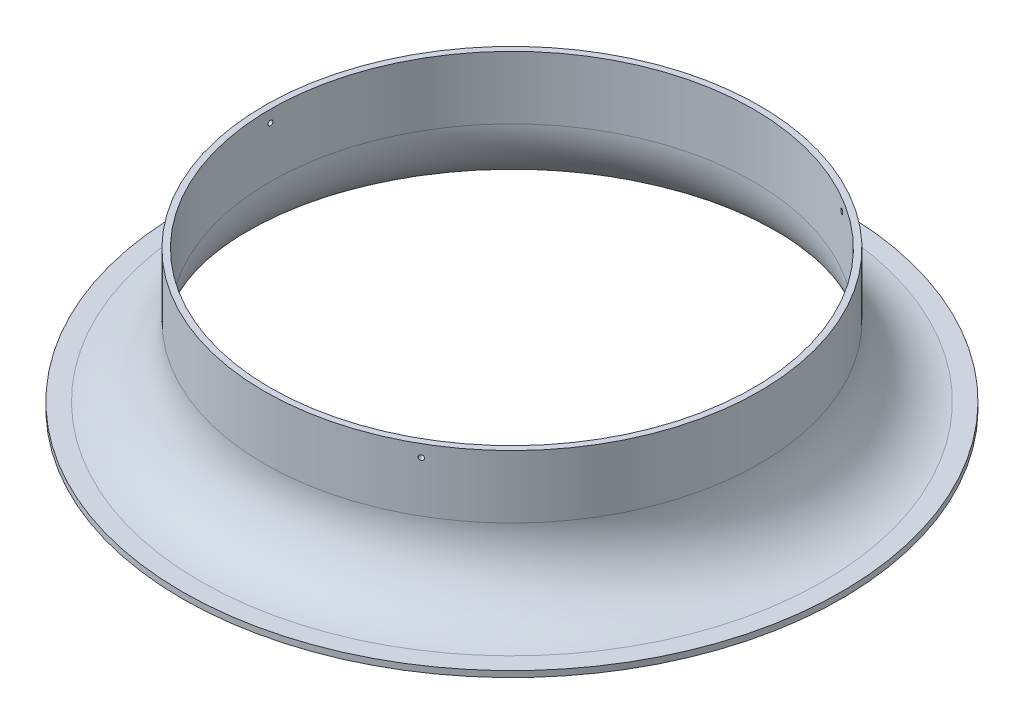
ISO-10303-21;
HEADER;
FILE_DESCRIPTION(('STEP AP214'),'2;1');
FILE_NAME('part.step','',(''),(''),'','','');
FILE_SCHEMA(('AUTOMOTIVE_DESIGN { 1 0 10303 214 1 1 1 1 }'));
ENDSEC;
DATA;
#1=APPLICATION_CONTEXT('core data for automotive mechanical design processes');
#2=APPLICATION_PROTOCOL_DEFINITION('international standard','automotive_design',2000,#1);
#3=PRODUCT_CONTEXT('',#1,'mechanical');
#4=PRODUCT('Part','Part','',(#3));
#5=PRODUCT_RELATED_PRODUCT_CATEGORY('part','',(#4));
#6=PRODUCT_DEFINITION_FORMATION('','',#4);
#7=PRODUCT_DEFINITION_CONTEXT('part definition',#1,'design');
#8=PRODUCT_DEFINITION('design','',#6,#7);
#9=PRODUCT_DEFINITION_SHAPE('','',#8);
#10=(LENGTH_UNIT() NAMED_UNIT(*) SI_UNIT(.MILLI.,.METRE.));
#11=(NAMED_UNIT(*) PLANE_ANGLE_UNIT() SI_UNIT($,.RADIAN.));
#12=(NAMED_UNIT(*) SI_UNIT($,.STERADIAN.) SOLID_ANGLE_UNIT());
#13=UNCERTAINTY_MEASURE_WITH_UNIT(LENGTH_MEASURE(1.E-05),#10,'distance_accuracy_value','');
#14=(GEOMETRIC_REPRESENTATION_CONTEXT(3) GLOBAL_UNCERTAINTY_ASSIGNED_CONTEXT((#13)) GLOBAL_UNIT_ASSIGNED_CONTEXT((#10,
#11,#12)) REPRESENTATION_CONTEXT('',''));
#15=CARTESIAN_POINT('',(0.,0.,0.));
#16=DIRECTION('',(0.,0.,1.));
#17=DIRECTION('',(1.,0.,0.));
#18=AXIS2_PLACEMENT_3D('',#15,#16,#17);
#19=CARTESIAN_POINT('',(0.,91.,0.));
#20=DIRECTION('',(0.,1.,0.));
#21=DIRECTION('',(0.,0.,1.));
#22=AXIS2_PLACEMENT_3D('',#19,#20,#21);
#23=PLANE('',#22);
#24=CARTESIAN_POINT('',(0.,91.,0.));
#25=DIRECTION('',(0.,1.,0.));
#26=DIRECTION('',(0.,0.,1.));
#27=AXIS2_PLACEMENT_3D('',#24,#25,#26);
#28=CIRCLE('',#27,200.);
#29=CARTESIAN_POINT('',(0.,91.,200.));
#30=VERTEX_POINT('',#29);
#31=EDGE_CURVE('E206',#30,#30,#28,.T.);
#32=ORIENTED_EDGE('',*,*,#31,.F.);
#33=EDGE_LOOP('',(#32));
#34=FACE_BOUND('',#33,.T.);
#35=CARTESIAN_POINT('',(0.,91.,0.));
#36=DIRECTION('',(0.,1.,0.));
#37=DIRECTION('',(0.,0.,1.));
#38=AXIS2_PLACEMENT_3D('',#35,#36,#37);
#39=CIRCLE('',#38,205.);
#40=CARTESIAN_POINT('',(0.,91.,205.));
#41=VERTEX_POINT('',#40);
#42=EDGE_CURVE('E12',#41,#41,#39,.T.);
#43=ORIENTED_EDGE('',*,*,#42,.T.);
#44=EDGE_LOOP('',(#43));
#45=FACE_BOUND('',#44,.T.);
#46=ADVANCED_FACE('F39',(#34,#45),#23,.T.);
#47=CARTESIAN_POINT('',(0.,91.,0.));
#48=DIRECTION('',(0.,-1.,0.));
#49=DIRECTION('',(0.,0.,-1.));
#50=AXIS2_PLACEMENT_3D('',#47,#48,#49);
#51=CYLINDRICAL_SURFACE('',#50,205.);
#52=CARTESIAN_POINT('',(104.227172642709,81.,176.526758546423));
#53=CARTESIAN_POINT('',(104.227168395237,81.1123380097675,176.52676115103));
#54=CARTESIAN_POINT('',(104.218994986844,81.2247574071282,176.53158769367));
#55=CARTESIAN_POINT('',(104.186499321467,81.446499916236,176.550768056649));
#56=CARTESIAN_POINT('',(104.16215764248,81.5558191390448,176.565133335309));
#57=CARTESIAN_POINT('',(104.09800716114,81.7681167307759,176.602962273534));
#58=CARTESIAN_POINT('',(104.058205765456,81.871098108798,176.626421576188));
#59=CARTESIAN_POINT('',(103.964258372193,82.067814272913,176.681736289023));
#60=CARTESIAN_POINT('',(103.910115934623,82.1615513458919,176.713589615467));
#61=CARTESIAN_POINT('',(103.788988831066,82.337163911466,176.784758159353));
#62=CARTESIAN_POINT('',(103.722002440412,82.419037808497,176.824074378894));
#63=CARTESIAN_POINT('',(103.577067024338,82.5685870737823,176.909011151793));
#64=CARTESIAN_POINT('',(103.499117567966,82.6362618836161,176.954631952981));
#65=CARTESIAN_POINT('',(103.334447955804,82.7554882076823,177.050842824916));
#66=CARTESIAN_POINT('',(103.24772778861,82.8070397009503,177.101432902125));
#67=CARTESIAN_POINT('',(103.067959593281,82.892555505312,177.206113080374));
#68=CARTESIAN_POINT('',(102.974911579206,82.9265198554847,177.260203173638));
#69=CARTESIAN_POINT('',(102.785118426737,82.9758963905388,177.370322940449));
#70=CARTESIAN_POINT('',(102.688373400715,82.9913091388397,177.426352555039));
#71=CARTESIAN_POINT('',(102.493923864772,83.0031466610049,177.538751207088));
#72=CARTESIAN_POINT('',(102.396219356803,82.9995714734797,177.595120243855));
#73=CARTESIAN_POINT('',(102.202629180777,82.9735351842157,177.706598267463));
#74=CARTESIAN_POINT('',(102.10674345156,82.9510747187027,177.761707296687));
#75=CARTESIAN_POINT('',(101.919518293179,82.8879064123545,177.869118867847));
#76=CARTESIAN_POINT('',(101.828178869366,82.8471985500421,177.921421406479));
#77=CARTESIAN_POINT('',(101.652653289692,82.7486902947598,178.021763587781));
#78=CARTESIAN_POINT('',(101.56846725538,82.6908896114225,178.069803158014));
#79=CARTESIAN_POINT('',(101.409660255999,82.5598367412882,178.160290674583));
#80=CARTESIAN_POINT('',(101.335039289779,82.4865845563479,178.202738621589));
#81=CARTESIAN_POINT('',(101.197500564345,82.3267044295223,178.280879936458));
#82=CARTESIAN_POINT('',(101.134583294486,82.2400759286218,178.316573021886));
#83=CARTESIAN_POINT('',(101.022264856979,82.0559042566187,178.380229242276));
#84=CARTESIAN_POINT('',(100.972863691134,81.958361084059,178.408192376206));
#85=CARTESIAN_POINT('',(100.889000288048,81.7551287321912,178.455630210016));
#86=CARTESIAN_POINT('',(100.85453806485,81.649439545225,178.475104901917));
#87=CARTESIAN_POINT('',(100.801546552347,81.4329155018058,178.505039555558));
#88=CARTESIAN_POINT('',(100.783017257814,81.3220806470411,178.515499520257));
#89=CARTESIAN_POINT('',(100.762426882401,81.0984164298752,178.527122510115));
#90=CARTESIAN_POINT('',(100.76036512244,80.9855871499116,178.528285918643));
#91=CARTESIAN_POINT('',(100.772767559509,80.7611326610921,178.521285473649));
#92=CARTESIAN_POINT('',(100.787231755182,80.6495074521373,178.513121620895));
#93=CARTESIAN_POINT('',(100.832268115803,80.4306319777467,178.487686882075));
#94=CARTESIAN_POINT('',(100.862839973978,80.3233816290332,178.470416169452));
#95=CARTESIAN_POINT('',(100.93920962242,80.1162978481232,178.427234115205));
#96=CARTESIAN_POINT('',(100.985007414156,80.0164644166429,178.401322772747));
#97=CARTESIAN_POINT('',(101.090511256764,79.8270448436075,178.341560483357));
#98=CARTESIAN_POINT('',(101.150217762685,79.7374590374656,178.307709276656));
#99=CARTESIAN_POINT('',(101.281820839128,79.5710811200289,178.232989308407));
#100=CARTESIAN_POINT('',(101.353717417349,79.4942890168132,178.192120542427));
#101=CARTESIAN_POINT('',(101.507639213445,79.3556758276746,178.104483407025));
#102=CARTESIAN_POINT('',(101.589664773982,79.2938552484431,178.057714838015));
#103=CARTESIAN_POINT('',(101.761492711948,79.1869435213972,177.959569502419));
#104=CARTESIAN_POINT('',(101.851295080179,79.141852353796,177.908192741284));
#105=CARTESIAN_POINT('',(102.036108606868,79.0696802639663,177.802260602099));
#106=CARTESIAN_POINT('',(102.131119668855,79.0425990082937,177.747705282919));
#107=CARTESIAN_POINT('',(102.323644131753,79.0072143708042,177.63694486286));
#108=CARTESIAN_POINT('',(102.421157536465,78.9989110175094,177.580739759475));
#109=CARTESIAN_POINT('',(102.615910454843,79.0013180088449,177.468271997391));
#110=CARTESIAN_POINT('',(102.713149980207,79.0120275286905,177.412009341295));
#111=CARTESIAN_POINT('',(102.904603663946,79.0521546190525,177.301028742073));
#112=CARTESIAN_POINT('',(102.998817816244,79.0815722271406,177.246310802051));
#113=CARTESIAN_POINT('',(103.18155971839,79.1582809187302,177.139992431689));
#114=CARTESIAN_POINT('',(103.270087362804,79.2055723335183,177.088392059154));
#115=CARTESIAN_POINT('',(103.438956139936,79.3166841136363,176.989807402757));
#116=CARTESIAN_POINT('',(103.51929759124,79.3805038353835,176.942822939257));
#117=CARTESIAN_POINT('',(103.669534847217,79.5228561233377,176.854841994794));
#118=CARTESIAN_POINT('',(103.739431310705,79.6013877608893,176.813845136166));
#119=CARTESIAN_POINT('',(103.866840915467,79.7709630747789,176.739030304498));
#120=CARTESIAN_POINT('',(103.924350975797,79.8620098548782,176.705214117578));
#121=CARTESIAN_POINT('',(104.025378969211,80.0540488802093,176.645758451921));
#122=CARTESIAN_POINT('',(104.068889955773,80.1550460305758,176.620123032637));
#123=CARTESIAN_POINT('',(104.140624529203,80.3640063232374,176.577835735522));
#124=CARTESIAN_POINT('',(104.168866432679,80.4719609445803,176.56117309415));
#125=CARTESIAN_POINT('',(104.201751968908,80.6505024418834,176.541765840283));
#126=CARTESIAN_POINT('',(104.211272978661,80.7199293229409,176.536145419518));
#127=CARTESIAN_POINT('',(104.223984643264,80.8595601979257,176.528640958421));
#128=CARTESIAN_POINT('',(104.227175298307,80.9297641918293,176.526756917974));
#129=CARTESIAN_POINT('',(104.227172642709,81.,176.526758546423));
#130=B_SPLINE_CURVE_WITH_KNOTS('',3,(#52,#53,#54,#55,#56,#57,#58,#59,#60,#61,#62,#63,#64,#65,
#66,#67,#68,#69,#70,#71,#72,#73,#74,#75,#76,#77,#78,#79,#80,#81,#82,#83,#84,#85,#86,#87,#88,#89,
#90,#91,#92,#93,#94,#95,#96,#97,#98,#99,#100,#101,#102,#103,#104,#105,#106,#107,#108,#109,#110,
#111,#112,#113,#114,#115,#116,#117,#118,#119,#120,#121,#122,#123,#124,#125,#126,#127,#128,#129),
.UNSPECIFIED.,.T.,.F.,(4,2,2,2,2,2,2,2,2,2,2,2,2,2,2,2,2,2,2,2,2,2,2,2,2,2,2,2,2,2,2,2,2,2,2,2,
2,2,4),(0.,0.336757667809877,0.673920596383109,1.01092219081739,1.34784020647964,
1.68480349470548,2.02178003251327,2.35875700847501,2.6957332356654,3.03269922849439,
3.36966453612855,3.70661849220028,4.04357284486868,4.38053292193796,4.71749295851461,
5.05446708093893,5.39144124835089,5.72841573255819,6.06539010619509,6.40235058372321,
6.73931103358174,7.07626506623916,7.41321913143483,7.75018422225991,8.08714952587419,
8.4241262320402,8.76110253964459,9.09807260813512,9.43504318845568,9.77199915124033,
10.1089557907411,10.4459186759569,10.7828684424111,11.1197969468573,11.4568091609947,
11.7939883479458,12.1307621562335,12.3413093052063,12.5518564477563),.UNSPECIFIED.);
#131=CARTESIAN_POINT('',(102.500000000001,83.,177.53520777581));
#132=VERTEX_POINT('',#131);
#133=CARTESIAN_POINT('',(102.500000000001,79.,177.53520777581));
#134=VERTEX_POINT('',#133);
#135=EDGE_CURVE('E44',#132,#134,#130,.T.);
#136=ORIENTED_EDGE('',*,*,#135,.F.);
#137=EDGE_CURVE('E327',#134,#132,#130,.T.);
#138=ORIENTED_EDGE('',*,*,#137,.F.);
#139=EDGE_LOOP('',(#136,#138));
#140=FACE_BOUND('',#139,.T.);
#141=CARTESIAN_POINT('',(100.763071027569,81.,-178.526758546424));
#142=CARTESIAN_POINT('',(100.763075406961,81.1123380097675,-178.526756170309));
#143=CARTESIAN_POINT('',(100.771342019696,81.2247574071282,-178.522091062326));
#144=CARTESIAN_POINT('',(100.804200533977,81.446499916236,-178.503539172086));
#145=CARTESIAN_POINT('',(100.828812069724,81.5558191390448,-178.489641299042));
#146=CARTESIAN_POINT('',(100.893648131894,81.7681167307759,-178.452999821649));
#147=CARTESIAN_POINT('',(100.93386518179,81.871098108798,-178.430260453208));
#148=CARTESIAN_POINT('',(101.02874282494,82.067814272913,-178.37655698044));
#149=CARTESIAN_POINT('',(101.08339983362,82.1615513458918,-178.345594917304));
#150=CARTESIAN_POINT('',(101.205597152354,82.337163911466,-178.276280040479));
#151=CARTESIAN_POINT('',(101.273139192584,82.419037808497,-178.237926234235));
#152=CARTESIAN_POINT('',(101.419164303667,82.5685870737823,-178.154876868458));
#153=CARTESIAN_POINT('',(101.497647804623,82.6362618836161,-178.110181059622));
#154=CARTESIAN_POINT('',(101.663303669921,82.7554882076823,-178.015678428226));
#155=CARTESIAN_POINT('',(101.750476045559,82.8070397009502,-177.96587159902));
#156=CARTESIAN_POINT('',(101.931015836861,82.892555505312,-177.862527864197));
#157=CARTESIAN_POINT('',(102.024383238758,82.9265198554847,-177.808990966868));
#158=CARTESIAN_POINT('',(102.214646330509,82.9758963905388,-177.699685158771));
#159=CARTESIAN_POINT('',(102.31154191312,82.9913091388397,-177.643916315841));
#160=CARTESIAN_POINT('',(102.506106769116,83.0031466610049,-177.531717403985));
#161=CARTESIAN_POINT('',(102.603776040929,82.9995714734797,-177.475287336403));
#162=CARTESIAN_POINT('',(102.797113929349,82.9735351842157,-177.363372337846));
#163=CARTESIAN_POINT('',(102.892782613244,82.9510747187027,-177.307887375095));
#164=CARTESIAN_POINT('',(103.079416341719,82.8879064123545,-177.199451417289));
#165=CARTESIAN_POINT('',(103.170381380763,82.8471985500421,-177.146500425217));
#166=CARTESIAN_POINT('',(103.345043048679,82.7486902947598,-177.044661904856));
#167=CARTESIAN_POINT('',(103.428739554044,82.6908896114225,-176.995774445615));
#168=CARTESIAN_POINT('',(103.586507541808,82.5598367412882,-176.903487308136));
#169=CARTESIAN_POINT('',(103.660579025364,82.4865845563479,-176.860087629238));
#170=CARTESIAN_POINT('',(103.797020751843,82.3267044295223,-176.780046256442));
#171=CARTESIAN_POINT('',(103.859390505492,82.2400759286218,-176.743404845122));
#172=CARTESIAN_POINT('',(103.970677628213,82.0559042566187,-176.677962335122));
#173=CARTESIAN_POINT('',(104.019594995487,81.958361084059,-176.649161237489));
#174=CARTESIAN_POINT('',(104.102609066211,81.7551287321912,-176.600252316873));
#175=CARTESIAN_POINT('',(104.136705755727,81.649439545225,-176.580144502064));
#176=CARTESIAN_POINT('',(104.189125682485,81.4329155018058,-176.549219832872));
#177=CARTESIAN_POINT('',(104.207448924904,81.3220806470411,-176.538402975441));
#178=CARTESIAN_POINT('',(104.227809917095,81.0984164298752,-176.52638268219));
#179=CARTESIAN_POINT('',(104.229848338416,80.9855871499116,-176.52517884995));
#180=CARTESIAN_POINT('',(104.217584556679,80.7611326610921,-176.532419453024));
#181=CARTESIAN_POINT('',(104.203282354964,80.6495074521373,-176.540863887545));
#182=CARTESIAN_POINT('',(104.158737044698,80.4306319777467,-176.567149150527));
#183=CARTESIAN_POINT('',(104.128494239736,80.3233816290332,-176.584989800036));
#184=CARTESIAN_POINT('',(104.05291265955,80.1162978481233,-176.629536828541));
#185=CARTESIAN_POINT('',(104.007573882868,80.0164644166429,-176.656243208393));
#186=CARTESIAN_POINT('',(103.903066300763,79.8270448436075,-176.717731071593));
#187=CARTESIAN_POINT('',(103.843897042851,79.7374590374656,-176.752512819141));
#188=CARTESIAN_POINT('',(103.713386113956,79.5710811200289,-176.829124442433));
#189=CARTESIAN_POINT('',(103.642044435285,79.4942890168132,-176.870954322627));
#190=CARTESIAN_POINT('',(103.489187551665,79.3556758276746,-176.960435940542));
#191=CARTESIAN_POINT('',(103.407672002534,79.2938552484431,-177.008087875221));
#192=CARTESIAN_POINT('',(103.236761679662,79.1869435213972,-177.107822566782));
#193=CARTESIAN_POINT('',(103.14736691524,79.141852353796,-177.159905318422));
#194=CARTESIAN_POINT('',(102.963220228284,79.0696802639663,-177.266992457906));
#195=CARTESIAN_POINT('',(102.868468404969,79.0425990082937,-177.321996791637));
#196=CARTESIAN_POINT('',(102.676284836015,79.0072143708042,-177.433347657327));
#197=CARTESIAN_POINT('',(102.578853086305,78.9989110175094,-177.489694191325));
#198=CARTESIAN_POINT('',(102.384076688045,79.0013180088449,-177.60212128506));
#199=CARTESIAN_POINT('',(102.286732035899,79.0120275286905,-177.658201856228));
#200=CARTESIAN_POINT('',(102.094893175777,79.0521546190525,-177.768515310383));
#201=CARTESIAN_POINT('',(102.000398973525,79.0815722271406,-177.822748189659));
#202=CARTESIAN_POINT('',(101.81695361283,79.1582809187302,-177.927848134072));
#203=CARTESIAN_POINT('',(101.728002557163,79.2055723335183,-177.978715136804));
#204=CARTESIAN_POINT('',(101.558191351734,79.3166841136363,-178.075667459507));
#205=CARTESIAN_POINT('',(101.477330887108,79.3805038353835,-178.121752965564));
#206=CARTESIAN_POINT('',(101.326018526165,79.5228561233377,-178.207871773604));
#207=CARTESIAN_POINT('',(101.255565973374,79.6013877608893,-178.247905457305));
#208=CARTESIAN_POINT('',(101.127069626189,79.7709630747789,-178.320837995881));
#209=CARTESIAN_POINT('',(101.069028919092,79.8620098548782,-178.35373507564));
#210=CARTESIAN_POINT('',(100.967024805527,80.0540488802093,-178.411500051601));
#211=CARTESIAN_POINT('',(100.923068387909,80.1550460305758,-178.436363961666));
#212=CARTESIAN_POINT('',(100.850579227636,80.3640063232374,-178.477344276028));
#213=CARTESIAN_POINT('',(100.822028005175,80.4719609445803,-178.493471161204));
#214=CARTESIAN_POINT('',(100.788778062194,80.6505024418833,-178.512247244062));
#215=CARTESIAN_POINT('',(100.779150130155,80.7199293229409,-178.517682469995));
#216=CARTESIAN_POINT('',(100.766295243901,80.8595601979257,-178.524938863917));
#217=CARTESIAN_POINT('',(100.763068289491,80.9297641918293,-178.526760032015));
#218=CARTESIAN_POINT('',(100.763071027569,81.,-178.526758546424));
#219=B_SPLINE_CURVE_WITH_KNOTS('',3,(#141,#142,#143,#144,#145,#146,#147,#148,#149,#150,#151,
#152,#153,#154,#155,#156,#157,#158,#159,#160,#161,#162,#163,#164,#165,#166,#167,#168,#169,#170,
#171,#172,#173,#174,#175,#176,#177,#178,#179,#180,#181,#182,#183,#184,#185,#186,#187,#188,#189,
#190,#191,#192,#193,#194,#195,#196,#197,#198,#199,#200,#201,#202,#203,#204,#205,#206,#207,#208,
#209,#210,#211,#212,#213,#214,#215,#216,#217,#218),.UNSPECIFIED.,.T.,.F.,(4,2,2,2,2,2,2,2,2,2,2,
2,2,2,2,2,2,2,2,2,2,2,2,2,2,2,2,2,2,2,2,2,2,2,2,2,2,2,4),(0.,0.336757667809877,
0.673920596383108,1.01092219081739,1.34784020647961,1.68480349470546,2.02178003251327,
2.35875700847499,2.69573323566539,3.03269922849439,3.36966453612856,3.70661849220029,
4.04357284486868,4.38053292193795,4.71749295851463,5.05446708093894,5.3914412483509,
5.72841573255819,6.06539010619509,6.40235058372322,6.73931103358174,7.07626506623916,
7.41321913143483,7.75018422225989,8.08714952587418,8.42412623204019,8.76110253964458,
9.09807260813511,9.43504318845565,9.77199915124033,10.1089557907411,10.4459186759569,
10.7828684424111,11.1197969468573,11.4568091609947,11.7939883479458,12.1307621562335,
12.3413093052062,12.5518564477563),.UNSPECIFIED.);
#220=CARTESIAN_POINT('',(102.499999999998,83.,-177.535207775811));
#221=VERTEX_POINT('',#220);
#222=CARTESIAN_POINT('',(102.499999999998,79.,-177.535207775811));
#223=VERTEX_POINT('',#222);
#224=EDGE_CURVE('E64',#221,#223,#219,.T.);
#225=ORIENTED_EDGE('',*,*,#224,.F.);
#226=EDGE_CURVE('E76',#223,#221,#219,.T.);
#227=ORIENTED_EDGE('',*,*,#226,.F.);
#228=EDGE_LOOP('',(#225,#227));
#229=FACE_BOUND('',#228,.T.);
#230=CARTESIAN_POINT('',(-204.990243670278,81.,2.));
#231=CARTESIAN_POINT('',(-204.990243802198,81.1123380097675,1.99999501927744));
#232=CARTESIAN_POINT('',(-204.990337006541,81.2247574071282,1.99050336865397));
#233=CARTESIAN_POINT('',(-204.990699855446,81.446499916236,1.95277111543561));
#234=CARTESIAN_POINT('',(-204.990969712204,81.5558191390448,1.92450796373124));
#235=CARTESIAN_POINT('',(-204.991655293035,81.7681167307759,1.85003754811353));
#236=CARTESIAN_POINT('',(-204.992070947247,81.871098108798,1.80383887701849));
#237=CARTESIAN_POINT('',(-204.993001197134,82.067814272913,1.69482069141531));
#238=CARTESIAN_POINT('',(-204.993515768244,82.1615513458919,1.63200530183511));
#239=CARTESIAN_POINT('',(-204.994585983421,82.337163911466,1.49152188112479));
#240=CARTESIAN_POINT('',(-204.995141632997,82.419037808497,1.4138518553402));
#241=CARTESIAN_POINT('',(-204.996231328007,82.5685870737823,1.24586571666291));
#242=CARTESIAN_POINT('',(-204.99676537259,82.6362618836161,1.15554910663919));
#243=CARTESIAN_POINT('',(-204.997751625725,82.7554882076823,0.964835603307878));
#244=CARTESIAN_POINT('',(-204.99820383417,82.8070397009503,0.864438696893554));
#245=CARTESIAN_POINT('',(-204.998975430142,82.892555505312,0.656414783821005));
#246=CARTESIAN_POINT('',(-204.999294817964,82.9265198554847,0.548787793228743));
#247=CARTESIAN_POINT('',(-204.999764757247,82.9758963905388,0.329362218320729));
#248=CARTESIAN_POINT('',(-204.999915313835,82.9913091388397,0.217563760800424));
#249=CARTESIAN_POINT('',(-205.000030633889,83.0031466610049,-0.00703380310431611));
#250=CARTESIAN_POINT('',(-204.999995397732,82.9995714734797,-0.119832907453546));
#251=CARTESIAN_POINT('',(-204.999743110127,82.9735351842157,-0.343225929618458));
#252=CARTESIAN_POINT('',(-204.999526064805,82.9510747187027,-0.453819921593636));
#253=CARTESIAN_POINT('',(-204.998934634899,82.8879064123546,-0.669667450558952));
#254=CARTESIAN_POINT('',(-204.99856025013,82.8471985500421,-0.774920981263191));
#255=CARTESIAN_POINT('',(-204.997696338371,82.7486902947598,-0.977101682926152));
#256=CARTESIAN_POINT('',(-204.997206809425,82.6908896114225,-1.07402871240085));
#257=CARTESIAN_POINT('',(-204.996167797808,82.5598367412882,-1.25680336644838));
#258=CARTESIAN_POINT('',(-204.995618315144,82.4865845563479,-1.34265099235263));
#259=CARTESIAN_POINT('',(-204.994521316188,82.3267044295223,-1.50083368001736));
#260=CARTESIAN_POINT('',(-204.993973799979,82.2400759286218,-1.57316817676583));
#261=CARTESIAN_POINT('',(-204.992942485192,82.0559042566187,-1.70226690715558));
#262=CARTESIAN_POINT('',(-204.992458686622,81.958361084059,-1.75903113871815));
#263=CARTESIAN_POINT('',(-204.99160935426,81.7551287321912,-1.85537789314405));
#264=CARTESIAN_POINT('',(-204.991243820578,81.649439545225,-1.8949603998545));
#265=CARTESIAN_POINT('',(-204.990672234833,81.4329155018058,-1.95581972268782));
#266=CARTESIAN_POINT('',(-204.990466182718,81.3220806470412,-1.97709654481727));
#267=CARTESIAN_POINT('',(-204.990236799497,81.0984164298752,-2.00073982792685));
#268=CARTESIAN_POINT('',(-204.990213460856,80.9855871499116,-2.003107068694));
#269=CARTESIAN_POINT('',(-204.990352116189,80.7611326610921,-1.98886602062687));
#270=CARTESIAN_POINT('',(-204.990514110147,80.6495074521373,-1.97225773335078));
#271=CARTESIAN_POINT('',(-204.991005160501,80.4306319777467,-1.92053773154975));
#272=CARTESIAN_POINT('',(-204.991334213716,80.3233816290332,-1.88542636941704));
#273=CARTESIAN_POINT('',(-204.992122281971,80.1162978481232,-1.79769728666529));
#274=CARTESIAN_POINT('',(-204.992581297024,80.0164644166429,-1.74507956435572));
#275=CARTESIAN_POINT('',(-204.993577557528,79.8270448436075,-1.62382941176518));
#276=CARTESIAN_POINT('',(-204.994114805537,79.7374590374656,-1.55519645751589));
#277=CARTESIAN_POINT('',(-204.995206953085,79.5710811200289,-1.40386486597505));
#278=CARTESIAN_POINT('',(-204.995761852635,79.4942890168132,-1.32116621980121));
#279=CARTESIAN_POINT('',(-204.996826765111,79.3556758276746,-1.14404746648463));
#280=CARTESIAN_POINT('',(-204.997336776517,79.2938552484431,-1.04962696279465));
#281=CARTESIAN_POINT('',(-204.998254391611,79.1869435213972,-0.851746935638301));
#282=CARTESIAN_POINT('',(-204.99866199542,79.141852353796,-0.748287422863031));
#283=CARTESIAN_POINT('',(-204.999328835153,79.0696802639663,-0.535268144194743));
#284=CARTESIAN_POINT('',(-204.999588073825,79.0425990082937,-0.425708491283334));
#285=CARTESIAN_POINT('',(-204.999928967769,79.0072143708042,-0.20359720553386));
#286=CARTESIAN_POINT('',(-205.000010622771,78.9989110175094,-0.091045568151476));
#287=CARTESIAN_POINT('',(-204.999987142889,79.0013180088449,0.133849287666731));
#288=CARTESIAN_POINT('',(-204.999882016107,79.0120275286905,0.24619251493182));
#289=CARTESIAN_POINT('',(-204.999496839723,79.0521546190525,0.467486568308419));
#290=CARTESIAN_POINT('',(-204.99921678977,79.0815722271406,0.576437387606442));
#291=CARTESIAN_POINT('',(-204.998513331221,79.1582809187302,0.787855702381493));
#292=CARTESIAN_POINT('',(-204.998089919968,79.2055723335183,0.890323077648376));
#293=CARTESIAN_POINT('',(-204.99714749167,79.3166841136363,1.08586005674925));
#294=CARTESIAN_POINT('',(-204.996628478349,79.3805038353835,1.17893002630538));
#295=CARTESIAN_POINT('',(-204.995553373383,79.5228561233377,1.35302977880849));
#296=CARTESIAN_POINT('',(-204.99499728408,79.6013877608893,1.43406032113771));
#297=CARTESIAN_POINT('',(-204.993910541657,79.7709630747789,1.58180769138151));
#298=CARTESIAN_POINT('',(-204.99337989489,79.8620098548782,1.64852095806027));
#299=CARTESIAN_POINT('',(-204.992403774738,80.0540488802093,1.7657415996785));
#300=CARTESIAN_POINT('',(-204.991958343683,80.1550460305758,1.81624092902735));
#301=CARTESIAN_POINT('',(-204.991203756839,80.3640063232374,1.89950854050427));
#302=CARTESIAN_POINT('',(-204.990894437855,80.4719609445803,1.93229806705228));
#303=CARTESIAN_POINT('',(-204.990530031103,80.6505024418833,1.97048140377726));
#304=CARTESIAN_POINT('',(-204.990423108818,80.7199293229409,1.98153705047546));
#305=CARTESIAN_POINT('',(-204.990279887167,80.8595601979257,1.9962979054948));
#306=CARTESIAN_POINT('',(-204.990243587799,80.9297641918293,2.00000311404016));
#307=CARTESIAN_POINT('',(-204.990243670278,81.,2.));
#308=B_SPLINE_CURVE_WITH_KNOTS('',3,(#230,#231,#232,#233,#234,#235,#236,#237,#238,#239,#240,
#241,#242,#243,#244,#245,#246,#247,#248,#249,#250,#251,#252,#253,#254,#255,#256,#257,#258,#259,
#260,#261,#262,#263,#264,#265,#266,#267,#268,#269,#270,#271,#272,#273,#274,#275,#276,#277,#278,
#279,#280,#281,#282,#283,#284,#285,#286,#287,#288,#289,#290,#291,#292,#293,#294,#295,#296,#297,
#298,#299,#300,#301,#302,#303,#304,#305,#306,#307),.UNSPECIFIED.,.T.,.F.,(4,2,2,2,2,2,2,2,2,2,2,
2,2,2,2,2,2,2,2,2,2,2,2,2,2,2,2,2,2,2,2,2,2,2,2,2,2,2,4),(0.,0.336757667809877,
0.673920596383107,1.01092219081739,1.34784020647963,1.68480349470546,2.02178003251327,
2.35875700847501,2.6957332356654,3.03269922849439,3.36966453612855,3.70661849220027,
4.04357284486868,4.38053292193795,4.71749295851461,5.05446708093894,5.39144124835089,
5.72841573255818,6.06539010619508,6.40235058372319,6.73931103358174,7.07626506623916,
7.41321913143484,7.75018422225991,8.08714952587419,8.42412623204021,8.7611025396446,
9.09807260813514,9.43504318845567,9.77199915124033,10.1089557907411,10.4459186759569,
10.7828684424111,11.1197969468573,11.4568091609948,11.7939883479458,12.1307621562335,
12.3413093052062,12.5518564477563),.UNSPECIFIED.);
#309=CARTESIAN_POINT('',(-205.,83.,0.));
#310=VERTEX_POINT('',#309);
#311=CARTESIAN_POINT('',(-205.,79.,0.));
#312=VERTEX_POINT('',#311);
#313=EDGE_CURVE('E182',#310,#312,#308,.T.);
#314=ORIENTED_EDGE('',*,*,#313,.F.);
#315=EDGE_CURVE('E146',#312,#310,#308,.T.);
#316=ORIENTED_EDGE('',*,*,#315,.F.);
#317=EDGE_LOOP('',(#314,#316));
#318=FACE_BOUND('',#317,.T.);
#319=CARTESIAN_POINT('',(0.,39.,0.));
#320=DIRECTION('',(0.,1.,0.));
#321=DIRECTION('',(0.,0.,1.));
#322=AXIS2_PLACEMENT_3D('',#319,#320,#321);
#323=CIRCLE('',#322,205.);
#324=CARTESIAN_POINT('',(0.,39.,205.));
#325=VERTEX_POINT('',#324);
#326=EDGE_CURVE('E223',#325,#325,#323,.T.);
#327=ORIENTED_EDGE('',*,*,#326,.T.);
#328=EDGE_LOOP('',(#327));
#329=FACE_BOUND('',#328,.T.);
#330=ORIENTED_EDGE('',*,*,#42,.F.);
#331=EDGE_LOOP('',(#330));
#332=FACE_BOUND('',#331,.T.);
#333=ADVANCED_FACE('F41',(#140,#229,#318,#329,#332),#51,.T.);
#334=CARTESIAN_POINT('',(0.,91.,0.));
#335=DIRECTION('',(0.,-1.,0.));
#336=DIRECTION('',(0.,0.,-1.));
#337=AXIS2_PLACEMENT_3D('',#334,#335,#336);
#338=CYLINDRICAL_SURFACE('',#337,200.);
#339=CARTESIAN_POINT('',(101.727050682563,81.,172.196420286332));
#340=CARTESIAN_POINT('',(101.727046436782,81.1123378645623,172.19642289377));
#341=CARTESIAN_POINT('',(101.718874214604,81.2247571131686,172.201251442111));
#342=CARTESIAN_POINT('',(101.686383173751,81.4464993189056,172.220439609517));
#343=CARTESIAN_POINT('',(101.662044936572,81.5558183872558,172.234810691));
#344=CARTESIAN_POINT('',(101.597903217865,81.7681156692836,172.272654360576));
#345=CARTESIAN_POINT('',(101.558107143064,81.8710968924467,172.2961225897));
#346=CARTESIAN_POINT('',(101.464171684215,82.0678127775734,172.351457265125));
#347=CARTESIAN_POINT('',(101.410035859506,82.1615497261916,172.383321627371));
#348=CARTESIAN_POINT('',(101.288922449374,82.3371622313477,172.454513159491));
#349=CARTESIAN_POINT('',(101.22194312004,82.4190361744551,172.493841342808));
#350=CARTESIAN_POINT('',(101.077021549745,82.5685855652111,172.578801579729));
#351=CARTESIAN_POINT('',(100.999078877787,82.6362604543987,172.624433881164));
#352=CARTESIAN_POINT('',(100.834421703488,82.7554870330915,172.720666045139));
#353=CARTESIAN_POINT('',(100.747707180893,82.8070386853666,172.771265919149));
#354=CARTESIAN_POINT('',(100.567948568186,82.8925547956076,172.875962842085));
#355=CARTESIAN_POINT('',(100.474904492206,82.9265192928404,172.930059883203));
#356=CARTESIAN_POINT('',(100.285117222006,82.9758960520583,173.040189822331));
#357=CARTESIAN_POINT('',(100.188374146272,82.9913089077748,173.09622265833));
#358=CARTESIAN_POINT('',(99.9939261681858,83.0031466653212,173.208623742659));
#359=CARTESIAN_POINT('',(99.8962212678013,82.9995716059842,173.264991990303));
#360=CARTESIAN_POINT('',(99.702628190109,82.9735356150786,173.376464409646));
#361=CARTESIAN_POINT('',(99.6067399485901,82.9510753523,173.431568626038));
#362=CARTESIAN_POINT('',(99.4195077695388,82.8879075380884,173.538967182471));
#363=CARTESIAN_POINT('',(99.3281638373831,82.8471999650664,173.591261519188));
#364=CARTESIAN_POINT('',(99.1526276753004,82.7486923291688,173.691584876224));
#365=CARTESIAN_POINT('',(99.0684355731668,82.6908919609509,173.739613820326));
#366=CARTESIAN_POINT('',(98.9096156295763,82.5598397637112,173.830078819828));
#367=CARTESIAN_POINT('',(98.8349877871081,82.4865879363236,173.872514875819));
#368=CARTESIAN_POINT('',(98.6974351098484,82.3267083727688,173.950632577681));
#369=CARTESIAN_POINT('',(98.634510789104,82.2400800493794,173.98631392687));
#370=CARTESIAN_POINT('',(98.52217901872,82.0559086749041,174.049948068967));
#371=CARTESIAN_POINT('',(98.472771570887,81.9583656223594,174.077900860842));
#372=CARTESIAN_POINT('',(98.3888970640368,81.7551334336467,174.125320580708));
#373=CARTESIAN_POINT('',(98.3544300198167,81.649444289411,174.144787500294));
#374=CARTESIAN_POINT('',(98.3014308636425,81.432920260019,174.174710059351));
#375=CARTESIAN_POINT('',(98.2828987462314,81.3220853766251,174.185165701907));
#376=CARTESIAN_POINT('',(98.2623050514467,81.098421279172,174.196783979945));
#377=CARTESIAN_POINT('',(98.2602427605133,80.9855921517264,174.197947018031));
#378=CARTESIAN_POINT('',(98.272646412024,80.7611379225231,174.19094986807));
#379=CARTESIAN_POINT('',(98.2871123530044,80.6495128206588,174.182789680848));
#380=CARTESIAN_POINT('',(98.3321542318719,80.4306376214105,174.157365925171));
#381=CARTESIAN_POINT('',(98.362729847374,80.3233874365224,174.140102538889));
#382=CARTESIAN_POINT('',(98.4391085689335,80.1163039095148,174.09693798951));
#383=CARTESIAN_POINT('',(98.4849116766366,80.0164705681969,174.071036825481));
#384=CARTESIAN_POINT('',(98.590427164062,79.8270509168873,174.011296568248));
#385=CARTESIAN_POINT('',(98.6501400219964,79.7374649593549,173.977457202132));
#386=CARTESIAN_POINT('',(98.7817560343956,79.5710866558079,173.902761292091));
#387=CARTESIAN_POINT('',(98.8536591966984,79.4942943180192,173.861904743655));
#388=CARTESIAN_POINT('',(99.0075937682115,79.3556804512947,173.774290977037));
#389=CARTESIAN_POINT('',(99.0896255372481,79.2938594544582,173.727533549222));
#390=CARTESIAN_POINT('',(99.2614646972196,79.1869468687274,173.629408230848));
#391=CARTESIAN_POINT('',(99.3512720789077,79.1418552599389,173.578040345772));
#392=CARTESIAN_POINT('',(99.536093781598,79.0696823217608,173.472122744623));
#393=CARTESIAN_POINT('',(99.6311080013805,79.042600642397,173.417573090402));
#394=CARTESIAN_POINT('',(99.8236366346166,79.0072151494414,173.306820112888));
#395=CARTESIAN_POINT('',(99.9211510518318,78.9989113641025,173.250616787109));
#396=CARTESIAN_POINT('',(100.115903516731,79.0013174967505,173.13814861895));
#397=CARTESIAN_POINT('',(100.213141576782,79.0120265500332,173.081883779486));
#398=CARTESIAN_POINT('',(100.404590208776,79.0521526436263,172.970894988752));
#399=CARTESIAN_POINT('',(100.498800774638,79.0815697215058,172.916171040578));
#400=CARTESIAN_POINT('',(100.681533785722,79.158277295266,172.809837506916));
#401=CARTESIAN_POINT('',(100.770056125508,79.2055681223383,172.758227979157));
#402=CARTESIAN_POINT('',(100.938913191834,79.3166786833379,172.659622886923));
#403=CARTESIAN_POINT('',(101.019248236868,79.3804977739592,172.612627142969));
#404=CARTESIAN_POINT('',(101.169472488268,79.5228489330736,172.524622674449));
#405=CARTESIAN_POINT('',(101.239362331524,79.6013801038479,172.483613584853));
#406=CARTESIAN_POINT('',(101.366759084868,79.7709545541681,172.408774798271));
#407=CARTESIAN_POINT('',(101.424262914173,79.8620009374296,172.374946887497));
#408=CARTESIAN_POINT('',(101.525279620046,80.0540393556822,172.315469551898));
#409=CARTESIAN_POINT('',(101.568785537906,80.1550363048596,172.289824194877));
#410=CARTESIAN_POINT('',(101.640511692956,80.3639963253264,172.247519962478));
#411=CARTESIAN_POINT('',(101.668750244178,80.4719508757534,172.230850320343));
#412=CARTESIAN_POINT('',(101.701632346563,80.6504939649073,172.211434514267));
#413=CARTESIAN_POINT('',(101.711152484342,80.7199225048798,172.20581150393));
#414=CARTESIAN_POINT('',(101.723862979545,80.8595567584114,172.198303574892));
#415=CARTESIAN_POINT('',(101.727053337173,80.9297624719457,172.196418656072));
#416=CARTESIAN_POINT('',(101.727050682563,81.,172.196420286332));
#417=B_SPLINE_CURVE_WITH_KNOTS('',3,(#339,#340,#341,#342,#343,#344,#345,#346,#347,#348,#349,
#350,#351,#352,#353,#354,#355,#356,#357,#358,#359,#360,#361,#362,#363,#364,#365,#366,#367,#368,
#369,#370,#371,#372,#373,#374,#375,#376,#377,#378,#379,#380,#381,#382,#383,#384,#385,#386,#387,
#388,#389,#390,#391,#392,#393,#394,#395,#396,#397,#398,#399,#400,#401,#402,#403,#404,#405,#406,
#407,#408,#409,#410,#411,#412,#413,#414,#415,#416),.UNSPECIFIED.,.T.,.F.,(4,2,2,2,2,2,2,2,2,2,2,
2,2,2,2,2,2,2,2,2,2,2,2,2,2,2,2,2,2,2,2,2,2,2,2,2,2,2,4),(0.,0.336757225867096,
0.673919695459152,1.01092081028534,1.34783835465896,1.6848016786494,2.02177825321309,
2.35875560588225,2.69573220617676,3.0326980215011,3.36966314768285,3.70661634127762,
4.04356993353695,4.38052954543016,4.71748912168564,5.05446349452631,5.39143791240437,
5.72841266402239,6.0653873002398,6.40234733685936,6.73930734363975,7.07626060746723,
7.41321390770804,7.7501787939885,8.08714389692635,8.4241209742463,8.76109765083685,
9.0980677790056,9.43503841417565,9.77199372430975,10.1089497111134,10.445911941847,
10.7828610594491,11.1197896233872,11.4568018953271,11.7939814464687,12.1307556300178,
12.3413079308795,12.5518602249923),.UNSPECIFIED.);
#418=CARTESIAN_POINT('',(101.727050682563,81.,172.196420286332));
#419=VERTEX_POINT('',#418);
#420=EDGE_CURVE('E87',#419,#419,#417,.T.);
#421=ORIENTED_EDGE('',*,*,#420,.T.);
#422=EDGE_LOOP('',(#421));
#423=FACE_BOUND('',#422,.T.);
#424=CARTESIAN_POINT('',(98.2629490674233,81.,-174.196420286334));
#425=CARTESIAN_POINT('',(98.2629534484215,81.1123378645623,-174.196417913098));
#426=CARTESIAN_POINT('',(98.2712212050371,81.2247571131686,-174.191754835257));
#427=CARTESIAN_POINT('',(98.3040841658895,81.4464993189056,-174.173210852186));
#428=CARTESIAN_POINT('',(98.3286990061231,81.5558183872558,-174.159318861247));
#429=CARTESIAN_POINT('',(98.393543444702,81.7681156692836,-174.122692338192));
#430=CARTESIAN_POINT('',(98.4337655647049,81.8710968924467,-174.099962041006));
#431=CARTESIAN_POINT('',(98.528654528758,82.0678127775734,-174.046278885038));
#432=CARTESIAN_POINT('',(98.5833177882927,82.1615497261916,-174.015328066709));
#433=CARTESIAN_POINT('',(98.7055281687094,82.3371622313477,-173.946036542856));
#434=CARTESIAN_POINT('',(98.773077039213,82.4190361744552,-173.907694833782));
#435=CARTESIAN_POINT('',(98.9191155478466,82.5685855652111,-173.824669190811));
#436=CARTESIAN_POINT('',(98.9976056161013,82.6362604543987,-173.779985007574));
#437=CARTESIAN_POINT('',(99.1632737019139,82.7554870330915,-173.685503793704));
#438=CARTESIAN_POINT('',(99.2504517395324,82.8070386853666,-173.635706751264));
#439=CARTESIAN_POINT('',(99.4310012408467,82.8925547956076,-173.532379687579));
#440=CARTESIAN_POINT('',(99.5243726907138,82.9265192928404,-173.478849674667));
#441=CARTESIAN_POINT('',(99.7146416508164,82.9758960520583,-173.369554046924));
#442=CARTESIAN_POINT('',(99.8115390481043,82.9913089077748,-173.313788503697));
#443=CARTESIAN_POINT('',(100.006105231589,83.0031466653212,-173.201592157124));
#444=CARTESIAN_POINT('',(100.103774016208,82.9995716059842,-173.145161355139));
#445=CARTESIAN_POINT('',(100.297108502027,82.9735356150786,-173.033241041533));
#446=CARTESIAN_POINT('',(100.392774274037,82.9510753523,-172.977751496649));
#447=CARTESIAN_POINT('',(100.579400241764,82.8879075380884,-172.869302951401));
#448=CARTESIAN_POINT('',(100.670360431913,82.8471999650664,-172.816343954031));
#449=CARTESIAN_POINT('',(100.84501108874,82.7486923291688,-172.714486856902));
#450=CARTESIAN_POINT('',(100.928701425516,82.6908919609509,-172.665588829708));
#451=CARTESIAN_POINT('',(101.086456385033,82.5598397637112,-172.573279223682));
#452=CARTESIAN_POINT('',(101.160521008792,82.4865879363235,-172.52986764427));
#453=CARTESIAN_POINT('',(101.29694926172,82.3267083727688,-172.449802382336));
#454=CARTESIAN_POINT('',(101.359312376931,82.2400800493794,-172.41314899665));
#455=CARTESIAN_POINT('',(101.470587045727,82.0559086749041,-172.347683900894));
#456=CARTESIAN_POINT('',(101.519498597514,81.9583656223594,-172.318872191872));
#457=CARTESIAN_POINT('',(101.602502532983,81.7551334336467,-172.269944598143));
#458=CARTESIAN_POINT('',(101.636594901988,81.649444289411,-172.249828722048));
#459=CARTESIAN_POINT('',(101.689008176365,81.432920260019,-172.21889138595));
#460=CARTESIAN_POINT('',(101.707329087137,81.3220853766251,-172.208069922764));
#461=CARTESIAN_POINT('',(101.727687658459,81.098421279172,-172.196044398942));
#462=CARTESIAN_POINT('',(101.729726024453,80.9855921517264,-172.194839921647));
#463=CARTESIAN_POINT('',(101.717464489077,80.7611379225231,-172.202083223974));
#464=CARTESIAN_POINT('',(101.703164589153,80.6495128206588,-172.210531002742));
#465=CARTESIAN_POINT('',(101.658626031444,80.4306376214105,-172.236826536237));
#466=CARTESIAN_POINT('',(101.628387692617,80.3233874365224,-172.254674102857));
#467=CARTESIAN_POINT('',(101.552816735532,80.1163039095148,-172.299237741346));
#468=CARTESIAN_POINT('',(101.507484115644,80.0164705681969,-172.325953814175));
#469=CARTESIAN_POINT('',(101.402989791539,79.8270509168873,-172.387462778162));
#470=CARTESIAN_POINT('',(101.343827611867,79.7374649593549,-172.422255947007));
#471=CARTESIAN_POINT('',(101.213331050014,79.5710866558079,-172.498890802269));
#472=CARTESIAN_POINT('',(101.141996660005,79.4942943180192,-172.540732493218));
#473=CARTESIAN_POINT('',(100.989153626636,79.3556804512947,-172.63023685936));
#474=CARTESIAN_POINT('',(100.907644621814,79.2938594544582,-172.677899741355));
#475=CARTESIAN_POINT('',(100.736746023362,79.1869468687274,-172.777654160069));
#476=CARTESIAN_POINT('',(100.647356439104,79.1418552599389,-172.82974569152));
#477=CARTESIAN_POINT('',(100.463218254456,79.0696823217608,-172.936847180646));
#478=CARTESIAN_POINT('',(100.368469758241,79.042600642397,-172.991857081588));
#479=CARTESIAN_POINT('',(100.176290549552,79.0072151494414,-173.10321528017));
#480=CARTESIAN_POINT('',(100.078859833042,78.9989113641025,-173.159563579823));
#481=CARTESIAN_POINT('',(99.8840833098506,79.0013174967505,-173.271990077796));
#482=CARTESIAN_POINT('',(99.7867374995087,79.0120265500332,-173.328068288283));
#483=CARTESIAN_POINT('',(99.5948940712011,79.0521526436263,-173.438373271742));
#484=CARTESIAN_POINT('',(99.5003964589554,79.0815697215058,-173.492600040998));
#485=CARTESIAN_POINT('',(99.3169424119881,79.158277295266,-173.597684703875));
#486=CARTESIAN_POINT('',(99.2279860799791,79.2055681223383,-173.648542535052));
#487=CARTESIAN_POINT('',(99.0581630319983,79.3166786833379,-173.745474497983));
#488=CARTESIAN_POINT('',(98.977296001348,79.3804977739592,-173.791548815819));
#489=CARTESIAN_POINT('',(98.8259697702629,79.5228489330736,-173.877644599536));
#490=CARTESIAN_POINT('',(98.7555099352587,79.6013801038479,-173.917666434464));
#491=CARTESIAN_POINT('',(98.6269992682185,79.7709545541681,-173.990575865929));
#492=CARTESIAN_POINT('',(98.5689515234783,79.8620009374296,-174.023461687535));
#493=CARTESIAN_POINT('',(98.4669342869641,80.0540393556822,-174.081206053228));
#494=CARTESIAN_POINT('',(98.4229717973644,80.1550363048596,-174.106060604799));
#495=CARTESIAN_POINT('',(98.3504721798942,80.3639963253264,-174.147025160988));
#496=CARTESIAN_POINT('',(98.3219165707227,80.4719508757534,-174.163145642645));
#497=CARTESIAN_POINT('',(98.2886609382335,80.6504939649073,-174.181914475603));
#498=CARTESIAN_POINT('',(98.279031199546,80.7199225048798,-174.187347651598));
#499=CARTESIAN_POINT('',(98.2661738946676,80.8595567584114,-174.19460129882));
#500=CARTESIAN_POINT('',(98.2629463282713,80.9297624719457,-174.196421770163));
#501=CARTESIAN_POINT('',(98.2629490674233,81.,-174.196420286334));
#502=B_SPLINE_CURVE_WITH_KNOTS('',3,(#424,#425,#426,#427,#428,#429,#430,#431,#432,#433,#434,
#435,#436,#437,#438,#439,#440,#441,#442,#443,#444,#445,#446,#447,#448,#449,#450,#451,#452,#453,
#454,#455,#456,#457,#458,#459,#460,#461,#462,#463,#464,#465,#466,#467,#468,#469,#470,#471,#472,
#473,#474,#475,#476,#477,#478,#479,#480,#481,#482,#483,#484,#485,#486,#487,#488,#489,#490,#491,
#492,#493,#494,#495,#496,#497,#498,#499,#500,#501),.UNSPECIFIED.,.T.,.F.,(4,2,2,2,2,2,2,2,2,2,2,
2,2,2,2,2,2,2,2,2,2,2,2,2,2,2,2,2,2,2,2,2,2,2,2,2,2,2,4),(0.,0.336757225867097,
0.673919695459147,1.01092081028534,1.34783835465896,1.68480167864942,2.0217782532131,
2.35875560588224,2.69573220617675,3.0326980215011,3.36966314768284,3.70661634127761,
4.04356993353697,4.38052954543019,4.71748912168565,5.0544634945263,5.39143791240434,
5.72841266402238,6.0653873002398,6.40234733685936,6.73930734363975,7.07626060746723,
7.41321390770804,7.75017879398853,8.08714389692636,8.42412097424631,8.76109765083686,
9.09806777900562,9.43503841417565,9.77199372430978,10.1089497111134,10.445911941847,
10.7828610594491,11.1197896233872,11.4568018953271,11.7939814464687,12.1307556300178,
12.3413079308795,12.5518602249923),.UNSPECIFIED.);
#503=CARTESIAN_POINT('',(98.2629490674233,81.,-174.196420286334));
#504=VERTEX_POINT('',#503);
#505=EDGE_CURVE('E82',#504,#504,#502,.T.);
#506=ORIENTED_EDGE('',*,*,#505,.T.);
#507=EDGE_LOOP('',(#506));
#508=FACE_BOUND('',#507,.T.);
#509=CARTESIAN_POINT('',(-199.989999749988,81.,2.));
#510=CARTESIAN_POINT('',(-199.989999885204,81.1123378645623,1.99999501932648));
#511=CARTESIAN_POINT('',(-199.990095419642,81.2247571131686,1.99050339314459));
#512=CARTESIAN_POINT('',(-199.990467339641,81.4464993189056,1.95277124266732));
#513=CARTESIAN_POINT('',(-199.990743942695,81.5558183872558,1.92450817024511));
#514=CARTESIAN_POINT('',(-199.991446662567,81.7681156692836,1.85003797761445));
#515=CARTESIAN_POINT('',(-199.99187270777,81.8710968924467,1.80383945130459));
#516=CARTESIAN_POINT('',(-199.992826212973,82.0678127775734,1.69482161991225));
#517=CARTESIAN_POINT('',(-199.993353647799,82.1615497261916,1.63200643933666));
#518=CARTESIAN_POINT('',(-199.994450618084,82.3371622313477,1.49152338336317));
#519=CARTESIAN_POINT('',(-199.995020159254,82.4190361744552,1.41385349097342));
#520=CARTESIAN_POINT('',(-199.996137097592,82.5685855652111,1.2458676110803));
#521=CARTESIAN_POINT('',(-199.996684493889,82.6362604543987,1.15555112640847));
#522=CARTESIAN_POINT('',(-199.997695405403,82.7554870330915,0.964837748563213));
#523=CARTESIAN_POINT('',(-199.998158920426,82.8070386853666,0.864440832113813));
#524=CARTESIAN_POINT('',(-199.998949809033,82.8925547956076,0.656416845492236));
#525=CARTESIAN_POINT('',(-199.999277182921,82.9265192928404,0.548789791463439));
#526=CARTESIAN_POINT('',(-199.999758872823,82.9758960520583,0.329364224591127));
#527=CARTESIAN_POINT('',(-199.999913194377,82.9913089077748,0.217565845365818));
#528=CARTESIAN_POINT('',(-200.000031399776,83.0031466653212,-0.00703158553589563));
#529=CARTESIAN_POINT('',(-199.999995284011,82.9995716059842,-0.119830635165318));
#530=CARTESIAN_POINT('',(-199.999736692137,82.9735356150786,-0.343223368115199));
#531=CARTESIAN_POINT('',(-199.999514222628,82.9510753523,-0.453817129390496));
#532=CARTESIAN_POINT('',(-199.998908011303,82.8879075380884,-0.669664231071424));
#533=CARTESIAN_POINT('',(-199.998524269297,82.8471999650664,-0.774917565158406));
#534=CARTESIAN_POINT('',(-199.997638764041,82.7486923291688,-0.977098019322552));
#535=CARTESIAN_POINT('',(-199.997136998683,82.6908919609509,-1.07402499061935));
#536=CARTESIAN_POINT('',(-199.99607201461,82.5598397637112,-1.25679959614728));
#537=CARTESIAN_POINT('',(-199.995508795901,82.4865879363235,-1.3426472315502));
#538=CARTESIAN_POINT('',(-199.994384371569,82.3267083727688,-1.50083019534653));
#539=CARTESIAN_POINT('',(-199.993823166035,82.2400800493794,-1.57316493022134));
#540=CARTESIAN_POINT('',(-199.992766064447,82.0559086749041,-1.70226416807452));
#541=CARTESIAN_POINT('',(-199.992270168402,81.9583656223594,-1.75902866897189));
#542=CARTESIAN_POINT('',(-199.991399597021,81.7551334336467,-1.85537598256702));
#543=CARTESIAN_POINT('',(-199.991024921806,81.649444289411,-1.89495877824797));
#544=CARTESIAN_POINT('',(-199.990439040008,81.432920260019,-1.95581867340219));
#545=CARTESIAN_POINT('',(-199.990227833369,81.3220853766251,-1.97709577914445));
#546=CARTESIAN_POINT('',(-199.989992709906,81.098421279172,-2.00073958100482));
#547=CARTESIAN_POINT('',(-199.989968784967,80.9855921517264,-2.00310709638613));
#548=CARTESIAN_POINT('',(-199.990110901102,80.7611379225231,-1.98886664409743));
#549=CARTESIAN_POINT('',(-199.990276942158,80.6495128206588,-1.97225867810778));
#550=CARTESIAN_POINT('',(-199.990780263317,80.4306376214105,-1.92053938893596));
#551=CARTESIAN_POINT('',(-199.991117539992,80.3233874365224,-1.88542843603367));
#552=CARTESIAN_POINT('',(-199.991925304467,80.1163039095148,-1.79770024816523));
#553=CARTESIAN_POINT('',(-199.992395792281,80.0164705681969,-1.74508301130725));
#554=CARTESIAN_POINT('',(-199.993416955602,79.8270509168873,-1.62383379008776));
#555=CARTESIAN_POINT('',(-199.993967633865,79.7374649593549,-1.5552012551261));
#556=CARTESIAN_POINT('',(-199.99508708441,79.5710866558079,-1.40387048982316));
#557=CARTESIAN_POINT('',(-199.995655856704,79.4942943180192,-1.32117225043813));
#558=CARTESIAN_POINT('',(-199.996747394849,79.3556804512947,-1.1440541176783));
#559=CARTESIAN_POINT('',(-199.997270159063,79.2938594544582,-1.04963380786758));
#560=CARTESIAN_POINT('',(-199.998210720583,79.1869468687274,-0.851754070780358));
#561=CARTESIAN_POINT('',(-199.998628518013,79.1418552599389,-0.748294654253211));
#562=CARTESIAN_POINT('',(-199.999312036055,79.0696823217608,-0.535275563978318));
#563=CARTESIAN_POINT('',(-199.999577759623,79.042600642397,-0.425716008815108));
#564=CARTESIAN_POINT('',(-199.99992718417,79.0072151494414,-0.203604832720166));
#565=CARTESIAN_POINT('',(-200.000010884875,78.9989113641025,-0.0910532072868563));
#566=CARTESIAN_POINT('',(-199.999986826582,79.0013174967505,0.133841458844344));
#567=CARTESIAN_POINT('',(-199.999879076291,79.0120265500332,0.246184508795635));
#568=CARTESIAN_POINT('',(-199.999484279977,79.0521526436263,0.467478282989057));
#569=CARTESIAN_POINT('',(-199.999197233595,79.0815697215058,0.576429000418308));
#570=CARTESIAN_POINT('',(-199.998476197711,79.158277295266,0.787847196957893));
#571=CARTESIAN_POINT('',(-199.998042205488,79.2055681223383,0.890314555893804));
#572=CARTESIAN_POINT('',(-199.997076223833,79.3166786833379,1.08585161105827));
#573=CARTESIAN_POINT('',(-199.996544238217,79.3804977739592,1.17892167284856));
#574=CARTESIAN_POINT('',(-199.995442258532,79.5228489330736,1.35302192508536));
#575=CARTESIAN_POINT('',(-199.994872266783,79.6013801038479,1.43405284960941));
#576=CARTESIAN_POINT('',(-199.993758353087,79.7709545541681,1.5818010676562));
#577=CARTESIAN_POINT('',(-199.993214437652,79.8620009374296,1.64851480003644));
#578=CARTESIAN_POINT('',(-199.992213907011,80.0540393556822,1.76573650132816));
#579=CARTESIAN_POINT('',(-199.991757335271,80.1550363048596,1.81623640992052));
#580=CARTESIAN_POINT('',(-199.990983872851,80.3639963253264,1.89950519850904));
#581=CARTESIAN_POINT('',(-199.990666814901,80.4719508757534,1.93229532230082));
#582=CARTESIAN_POINT('',(-199.990293284797,80.6504939649073,1.9704799613342));
#583=CARTESIAN_POINT('',(-199.990183683889,80.7199225048798,1.98153614766685));
#584=CARTESIAN_POINT('',(-199.990036874214,80.8595567584114,1.99629772392683));
#585=CARTESIAN_POINT('',(-199.989999665445,80.9297624719457,2.00000311408978));
#586=CARTESIAN_POINT('',(-199.989999749988,81.,2.));
#587=B_SPLINE_CURVE_WITH_KNOTS('',3,(#509,#510,#511,#512,#513,#514,#515,#516,#517,#518,#519,
#520,#521,#522,#523,#524,#525,#526,#527,#528,#529,#530,#531,#532,#533,#534,#535,#536,#537,#538,
#539,#540,#541,#542,#543,#544,#545,#546,#547,#548,#549,#550,#551,#552,#553,#554,#555,#556,#557,
#558,#559,#560,#561,#562,#563,#564,#565,#566,#567,#568,#569,#570,#571,#572,#573,#574,#575,#576,
#577,#578,#579,#580,#581,#582,#583,#584,#585,#586),.UNSPECIFIED.,.T.,.F.,(4,2,2,2,2,2,2,2,2,2,2,
2,2,2,2,2,2,2,2,2,2,2,2,2,2,2,2,2,2,2,2,2,2,2,2,2,2,2,4),(0.,0.336757225867096,
0.673919695459149,1.01092081028534,1.34783835465896,1.68480167864942,2.02177825321309,
2.35875560588225,2.69573220617676,3.03269802150111,3.36966314768285,3.70661634127762,
4.04356993353698,4.38052954543017,4.71748912168566,5.05446349452631,5.39143791240435,
5.72841266402239,6.0653873002398,6.40234733685936,6.73930734363975,7.07626060746723,
7.41321390770804,7.75017879398852,8.08714389692637,8.42412097424633,8.76109765083686,
9.09806777900562,9.43503841417565,9.77199372430977,10.1089497111134,10.445911941847,
10.7828610594491,11.1197896233872,11.4568018953271,11.7939814464686,12.1307556300178,
12.3413079308795,12.5518602249923),.UNSPECIFIED.);
#588=CARTESIAN_POINT('',(-199.989999749988,81.,2.));
#589=VERTEX_POINT('',#588);
#590=EDGE_CURVE('E166',#589,#589,#587,.T.);
#591=ORIENTED_EDGE('',*,*,#590,.T.);
#592=EDGE_LOOP('',(#591));
#593=FACE_BOUND('',#592,.T.);
#594=CARTESIAN_POINT('',(0.,39.,0.));
#595=DIRECTION('',(0.,1.,0.));
#596=DIRECTION('',(0.,0.,1.));
#597=AXIS2_PLACEMENT_3D('',#594,#595,#596);
#598=CIRCLE('',#597,200.);
#599=CARTESIAN_POINT('',(0.,39.,200.));
#600=VERTEX_POINT('',#599);
#601=EDGE_CURVE('E50',#600,#600,#598,.T.);
#602=ORIENTED_EDGE('',*,*,#601,.F.);
#603=EDGE_LOOP('',(#602));
#604=FACE_BOUND('',#603,.T.);
#605=ORIENTED_EDGE('',*,*,#31,.T.);
#606=EDGE_LOOP('',(#605));
#607=FACE_BOUND('',#606,.T.);
#608=ADVANCED_FACE('F188',(#423,#508,#593,#604,#607),#338,.F.);
#609=CARTESIAN_POINT('',(257.952454685135,-23.7799470949427,0.));
#610=DIRECTION('',(0.,1.,0.));
#611=DIRECTION('',(0.,0.,1.));
#612=AXIS2_PLACEMENT_3D('',#609,#610,#611);
#613=PLANE('',#612);
#614=CARTESIAN_POINT('',(0.,-23.7799470949427,0.));
#615=DIRECTION('',(0.,1.,0.));
#616=DIRECTION('',(0.,0.,1.));
#617=AXIS2_PLACEMENT_3D('',#614,#615,#616);
#618=CIRCLE('',#617,272.952454685135);
#619=CARTESIAN_POINT('',(0.,-23.7799470949427,272.952454685135));
#620=VERTEX_POINT('',#619);
#621=EDGE_CURVE('E210',#620,#620,#618,.T.);
#622=ORIENTED_EDGE('',*,*,#621,.F.);
#623=EDGE_LOOP('',(#622));
#624=FACE_BOUND('',#623,.T.);
#625=CARTESIAN_POINT('',(0.,-23.7799470949427,0.));
#626=DIRECTION('',(0.,1.,0.));
#627=DIRECTION('',(0.,0.,1.));
#628=AXIS2_PLACEMENT_3D('',#625,#626,#627);
#629=CIRCLE('',#628,257.73898842843);
#630=CARTESIAN_POINT('',(0.,-23.7799470949427,257.73898842843));
#631=VERTEX_POINT('',#630);
#632=EDGE_CURVE('E183',#631,#631,#629,.T.);
#633=ORIENTED_EDGE('',*,*,#632,.T.);
#634=EDGE_LOOP('',(#633));
#635=FACE_BOUND('',#634,.T.);
#636=ADVANCED_FACE('F192',(#624,#635),#613,.F.);
#637=CARTESIAN_POINT('',(0.,91.,0.));
#638=DIRECTION('',(0.,1.,0.));
#639=DIRECTION('',(0.,0.,1.));
#640=AXIS2_PLACEMENT_3D('',#637,#638,#639);
#641=CYLINDRICAL_SURFACE('',#640,272.952454685135);
#642=ORIENTED_EDGE('',*,*,#621,.T.);
#643=EDGE_LOOP('',(#642));
#644=FACE_BOUND('',#643,.T.);
#645=CARTESIAN_POINT('',(0.,-18.7799470949427,0.));
#646=DIRECTION('',(0.,1.,0.));
#647=DIRECTION('',(0.,0.,1.));
#648=AXIS2_PLACEMENT_3D('',#645,#646,#647);
#649=CIRCLE('',#648,272.952454685135);
#650=CARTESIAN_POINT('',(0.,-18.7799470949427,272.952454685135));
#651=VERTEX_POINT('',#650);
#652=EDGE_CURVE('E215',#651,#651,#649,.T.);
#653=ORIENTED_EDGE('',*,*,#652,.F.);
#654=EDGE_LOOP('',(#653));
#655=FACE_BOUND('',#654,.T.);
#656=ADVANCED_FACE('F250',(#644,#655),#641,.T.);
#657=CARTESIAN_POINT('',(257.952454685135,-18.7799470949427,0.));
#658=DIRECTION('',(0.,1.,0.));
#659=DIRECTION('',(0.,0.,1.));
#660=AXIS2_PLACEMENT_3D('',#657,#658,#659);
#661=PLANE('',#660);
#662=ORIENTED_EDGE('',*,*,#652,.T.);
#663=EDGE_LOOP('',(#662));
#664=FACE_BOUND('',#663,.T.);
#665=CARTESIAN_POINT('',(0.,-18.7799470949427,0.));
#666=DIRECTION('',(0.,1.,0.));
#667=DIRECTION('',(0.,0.,1.));
#668=AXIS2_PLACEMENT_3D('',#665,#666,#667);
#669=CIRCLE('',#668,257.952454685135);
#670=CARTESIAN_POINT('',(0.,-18.7799470949427,257.952454685135));
#671=VERTEX_POINT('',#670);
#672=EDGE_CURVE('E220',#671,#671,#669,.T.);
#673=ORIENTED_EDGE('',*,*,#672,.F.);
#674=EDGE_LOOP('',(#673));
#675=FACE_BOUND('',#674,.T.);
#676=ADVANCED_FACE('F245',(#664,#675),#661,.T.);
#677=CARTESIAN_POINT('',(0.,39.,0.));
#678=DIRECTION('',(0.,1.,0.));
#679=DIRECTION('',(0.,0.,1.));
#680=AXIS2_PLACEMENT_3D('',#677,#678,#679);
#681=TOROIDAL_SURFACE('',#680,263.,58.);
#682=ORIENTED_EDGE('',*,*,#672,.T.);
#683=EDGE_LOOP('',(#682));
#684=FACE_BOUND('',#683,.T.);
#685=ORIENTED_EDGE('',*,*,#326,.F.);
#686=EDGE_LOOP('',(#685));
#687=FACE_BOUND('',#686,.T.);
#688=ADVANCED_FACE('F239',(#684,#687),#681,.F.);
#689=CARTESIAN_POINT('',(0.,39.,0.));
#690=DIRECTION('',(0.,1.,0.));
#691=DIRECTION('',(0.,0.,1.));
#692=AXIS2_PLACEMENT_3D('',#689,#690,#691);
#693=TOROIDAL_SURFACE('',#692,263.,63.);
#694=ORIENTED_EDGE('',*,*,#632,.F.);
#695=EDGE_LOOP('',(#694));
#696=FACE_BOUND('',#695,.T.);
#697=ORIENTED_EDGE('',*,*,#601,.T.);
#698=EDGE_LOOP('',(#697));
#699=FACE_BOUND('',#698,.T.);
#700=ADVANCED_FACE('F161',(#696,#699),#693,.T.);
#701=CARTESIAN_POINT('',(-195.,81.,0.));
#702=DIRECTION('',(-1.,0.,0.));
#703=DIRECTION('',(0.,0.,1.));
#704=AXIS2_PLACEMENT_3D('',#701,#702,#703);
#705=CYLINDRICAL_SURFACE('',#704,2.);
#706=ORIENTED_EDGE('',*,*,#313,.T.);
#707=ORIENTED_EDGE('',*,*,#315,.T.);
#708=EDGE_LOOP('',(#706,#707));
#709=FACE_BOUND('',#708,.T.);
#710=ORIENTED_EDGE('',*,*,#590,.F.);
#711=EDGE_LOOP('',(#710));
#712=FACE_BOUND('',#711,.T.);
#713=ADVANCED_FACE('F152',(#709,#712),#705,.F.);
#714=CARTESIAN_POINT('',(97.4999999999984,81.,-168.874953737966));
#715=DIRECTION('',(0.499999999999992,0.,-0.866025403784443));
#716=DIRECTION('',(-0.866025403784443,0.,-0.499999999999992));
#717=AXIS2_PLACEMENT_3D('',#714,#715,#716);
#718=CYLINDRICAL_SURFACE('',#717,2.);
#719=ORIENTED_EDGE('',*,*,#224,.T.);
#720=ORIENTED_EDGE('',*,*,#226,.T.);
#721=EDGE_LOOP('',(#719,#720));
#722=FACE_BOUND('',#721,.T.);
#723=ORIENTED_EDGE('',*,*,#505,.F.);
#724=EDGE_LOOP('',(#723));
#725=FACE_BOUND('',#724,.T.);
#726=ADVANCED_FACE('F78',(#722,#725),#718,.F.);
#727=CARTESIAN_POINT('',(97.5000000000008,81.,168.874953737965));
#728=DIRECTION('',(0.500000000000004,0.,0.866025403784436));
#729=DIRECTION('',(0.866025403784436,0.,-0.500000000000004));
#730=AXIS2_PLACEMENT_3D('',#727,#728,#729);
#731=CYLINDRICAL_SURFACE('',#730,2.);
#732=ORIENTED_EDGE('',*,*,#135,.T.);
#733=ORIENTED_EDGE('',*,*,#137,.T.);
#734=EDGE_LOOP('',(#732,#733));
#735=FACE_BOUND('',#734,.T.);
#736=ORIENTED_EDGE('',*,*,#420,.F.);
#737=EDGE_LOOP('',(#736));
#738=FACE_BOUND('',#737,.T.);
#739=ADVANCED_FACE('F108',(#735,#738),#731,.F.);
#740=CLOSED_SHELL('',(#46,#333,#608,#636,#656,#676,#688,#700,#713,#726,#739));
#741=MANIFOLD_SOLID_BREP('B2',#740);
#742=ADVANCED_BREP_SHAPE_REPRESENTATION('',(#18,#741),#14);
#743=SHAPE_DEFINITION_REPRESENTATION(#9,#742);
ENDSEC;
END-ISO-10303-21;
